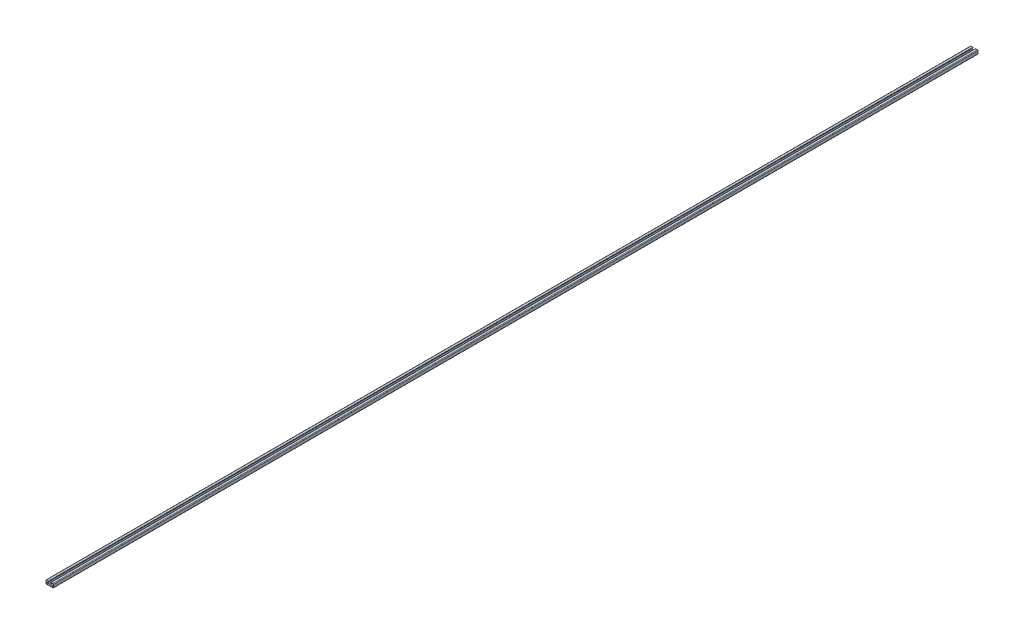
ISO-10303-21;
HEADER;
FILE_DESCRIPTION(('STEP AP214'),'2;1');
FILE_NAME('part.step','',(''),(''),'','','');
FILE_SCHEMA(('AUTOMOTIVE_DESIGN { 1 0 10303 214 1 1 1 1 }'));
ENDSEC;
DATA;
#1=APPLICATION_CONTEXT('core data for automotive mechanical design processes');
#2=APPLICATION_PROTOCOL_DEFINITION('international standard','automotive_design',2000,#1);
#3=PRODUCT_CONTEXT('',#1,'mechanical');
#4=PRODUCT('Part','Part','',(#3));
#5=PRODUCT_RELATED_PRODUCT_CATEGORY('part','',(#4));
#6=PRODUCT_DEFINITION_FORMATION('','',#4);
#7=PRODUCT_DEFINITION_CONTEXT('part definition',#1,'design');
#8=PRODUCT_DEFINITION('design','',#6,#7);
#9=PRODUCT_DEFINITION_SHAPE('','',#8);
#10=(LENGTH_UNIT() NAMED_UNIT(*) SI_UNIT(.MILLI.,.METRE.));
#11=(NAMED_UNIT(*) PLANE_ANGLE_UNIT() SI_UNIT($,.RADIAN.));
#12=(NAMED_UNIT(*) SI_UNIT($,.STERADIAN.) SOLID_ANGLE_UNIT());
#13=UNCERTAINTY_MEASURE_WITH_UNIT(LENGTH_MEASURE(1.E-05),#10,'distance_accuracy_value','');
#14=(GEOMETRIC_REPRESENTATION_CONTEXT(3) GLOBAL_UNCERTAINTY_ASSIGNED_CONTEXT((#13)) GLOBAL_UNIT_ASSIGNED_CONTEXT((#10,
#11,#12)) REPRESENTATION_CONTEXT('',''));
#15=CARTESIAN_POINT('',(0.,0.,0.));
#16=DIRECTION('',(0.,0.,1.));
#17=DIRECTION('',(1.,0.,0.));
#18=AXIS2_PLACEMENT_3D('',#15,#16,#17);
#19=CARTESIAN_POINT('',(0.,-1.87,3048.));
#20=DIRECTION('',(0.,-1.,0.));
#21=DIRECTION('',(1.,0.,0.));
#22=AXIS2_PLACEMENT_3D('',#19,#20,#21);
#23=PLANE('',#22);
#24=DIRECTION('',(-1.,0.,0.));
#25=VECTOR('',#24,1.);
#26=CARTESIAN_POINT('',(0.,-1.87,3048.));
#27=LINE('',#26,#25);
#28=CARTESIAN_POINT('',(1.68956591371127,-1.87,3048.));
#29=VERTEX_POINT('',#28);
#30=CARTESIAN_POINT('',(-1.68956591371128,-1.87,3048.));
#31=VERTEX_POINT('',#30);
#32=EDGE_CURVE('E389',#29,#31,#27,.T.);
#33=ORIENTED_EDGE('',*,*,#32,.F.);
#34=DIRECTION('',(0.,0.,-1.));
#35=VECTOR('',#34,1.);
#36=CARTESIAN_POINT('',(1.68956591371127,-1.87,0.));
#37=LINE('',#36,#35);
#38=CARTESIAN_POINT('',(1.68956591371127,-1.87,0.));
#39=VERTEX_POINT('',#38);
#40=EDGE_CURVE('E379',#29,#39,#37,.T.);
#41=ORIENTED_EDGE('',*,*,#40,.T.);
#42=DIRECTION('',(-1.,0.,0.));
#43=VECTOR('',#42,1.);
#44=CARTESIAN_POINT('',(0.,-1.87,0.));
#45=LINE('',#44,#43);
#46=CARTESIAN_POINT('',(-1.68956591371128,-1.87,0.));
#47=VERTEX_POINT('',#46);
#48=EDGE_CURVE('E388',#39,#47,#45,.T.);
#49=ORIENTED_EDGE('',*,*,#48,.T.);
#50=DIRECTION('',(0.,0.,-1.));
#51=VECTOR('',#50,1.);
#52=CARTESIAN_POINT('',(-1.68956591371128,-1.87,3048.));
#53=LINE('',#52,#51);
#54=EDGE_CURVE('E368',#47,#31,#53,.F.);
#55=ORIENTED_EDGE('',*,*,#54,.T.);
#56=EDGE_LOOP('',(#33,#41,#49,#55));
#57=FACE_BOUND('',#56,.T.);
#58=ADVANCED_FACE('F41',(#57),#23,.F.);
#59=CARTESIAN_POINT('',(-3.05778914340892,-2.14411755860608,3048.));
#60=DIRECTION('',(-0.818770593875491,-0.574120818821941,0.));
#61=DIRECTION('',(0.574120818821941,-0.818770593875491,0.));
#62=AXIS2_PLACEMENT_3D('',#59,#60,#61);
#63=PLANE('',#62);
#64=DIRECTION('',(-0.574120818821941,0.818770593875491,0.));
#65=VECTOR('',#64,1.);
#66=CARTESIAN_POINT('',(-3.05778914340892,-2.14411755860608,3048.));
#67=LINE('',#66,#65);
#68=CARTESIAN_POINT('',(-4.14587769533775,-0.592362456465821,3048.));
#69=VERTEX_POINT('',#68);
#70=CARTESIAN_POINT('',(-6.75724174982656,3.13178066397732,3048.));
#71=VERTEX_POINT('',#70);
#72=EDGE_CURVE('E532',#69,#71,#67,.T.);
#73=ORIENTED_EDGE('',*,*,#72,.F.);
#74=DIRECTION('',(0.,0.,-1.));
#75=VECTOR('',#74,1.);
#76=CARTESIAN_POINT('',(-4.14587769533775,-0.592362456465821,0.));
#77=LINE('',#76,#75);
#78=CARTESIAN_POINT('',(-4.14587769533775,-0.592362456465821,0.));
#79=VERTEX_POINT('',#78);
#80=EDGE_CURVE('E364',#69,#79,#77,.T.);
#81=ORIENTED_EDGE('',*,*,#80,.T.);
#82=DIRECTION('',(-0.574120818821941,0.818770593875491,0.));
#83=VECTOR('',#82,1.);
#84=CARTESIAN_POINT('',(-3.05778914340892,-2.14411755860608,0.));
#85=LINE('',#84,#83);
#86=CARTESIAN_POINT('',(-6.75724174982656,3.13178066397732,0.));
#87=VERTEX_POINT('',#86);
#88=EDGE_CURVE('E395',#79,#87,#85,.T.);
#89=ORIENTED_EDGE('',*,*,#88,.T.);
#90=DIRECTION('',(0.,0.,-1.));
#91=VECTOR('',#90,1.);
#92=CARTESIAN_POINT('',(-6.75724174982656,3.13178066397732,3048.));
#93=LINE('',#92,#91);
#94=EDGE_CURVE('E353',#87,#71,#93,.F.);
#95=ORIENTED_EDGE('',*,*,#94,.T.);
#96=EDGE_LOOP('',(#73,#81,#89,#95));
#97=FACE_BOUND('',#96,.T.);
#98=ADVANCED_FACE('F484',(#97),#63,.F.);
#99=CARTESIAN_POINT('',(0.,3.97,3048.));
#100=DIRECTION('',(0.,-1.,0.));
#101=DIRECTION('',(1.,0.,0.));
#102=AXIS2_PLACEMENT_3D('',#99,#100,#101);
#103=PLANE('',#102);
#104=DIRECTION('',(-1.,0.,0.));
#105=VECTOR('',#104,1.);
#106=CARTESIAN_POINT('',(0.,3.97,3048.));
#107=LINE('',#106,#105);
#108=CARTESIAN_POINT('',(-4.315,3.97,3048.));
#109=VERTEX_POINT('',#108);
#110=CARTESIAN_POINT('',(-6.32124640858786,3.97,3048.));
#111=VERTEX_POINT('',#110);
#112=EDGE_CURVE('E455',#109,#111,#107,.T.);
#113=ORIENTED_EDGE('',*,*,#112,.T.);
#114=DIRECTION('',(0.,0.,-1.));
#115=VECTOR('',#114,1.);
#116=CARTESIAN_POINT('',(-6.32124640858786,3.97,3048.));
#117=LINE('',#116,#115);
#118=CARTESIAN_POINT('',(-6.32124640858786,3.97,0.));
#119=VERTEX_POINT('',#118);
#120=EDGE_CURVE('E349',#111,#119,#117,.T.);
#121=ORIENTED_EDGE('',*,*,#120,.T.);
#122=DIRECTION('',(-1.,0.,0.));
#123=VECTOR('',#122,1.);
#124=CARTESIAN_POINT('',(0.,3.97,0.));
#125=LINE('',#124,#123);
#126=CARTESIAN_POINT('',(-4.315,3.97,0.));
#127=VERTEX_POINT('',#126);
#128=EDGE_CURVE('E226',#127,#119,#125,.T.);
#129=ORIENTED_EDGE('',*,*,#128,.F.);
#130=DIRECTION('',(0.,0.,-1.));
#131=VECTOR('',#130,1.);
#132=CARTESIAN_POINT('',(-4.315,3.97,3048.));
#133=LINE('',#132,#131);
#134=EDGE_CURVE('E251',#127,#109,#133,.F.);
#135=ORIENTED_EDGE('',*,*,#134,.T.);
#136=EDGE_LOOP('',(#113,#121,#129,#135));
#137=FACE_BOUND('',#136,.T.);
#138=ADVANCED_FACE('F489',(#137),#103,.T.);
#139=CARTESIAN_POINT('',(-3.25,0.,3048.));
#140=DIRECTION('',(1.,0.,0.));
#141=DIRECTION('',(0.,1.,0.));
#142=AXIS2_PLACEMENT_3D('',#139,#140,#141);
#143=PLANE('',#142);
#144=DIRECTION('',(0.,-1.,0.));
#145=VECTOR('',#144,1.);
#146=CARTESIAN_POINT('',(-3.25,0.,3048.));
#147=LINE('',#146,#145);
#148=CARTESIAN_POINT('',(-3.25,5.185,3048.));
#149=VERTEX_POINT('',#148);
#150=CARTESIAN_POINT('',(-3.25,5.035,3048.));
#151=VERTEX_POINT('',#150);
#152=EDGE_CURVE('E540',#149,#151,#147,.T.);
#153=ORIENTED_EDGE('',*,*,#152,.T.);
#154=DIRECTION('',(0.,0.,-1.));
#155=VECTOR('',#154,1.);
#156=CARTESIAN_POINT('',(-3.25,5.035,3048.));
#157=LINE('',#156,#155);
#158=CARTESIAN_POINT('',(-3.25,5.035,0.));
#159=VERTEX_POINT('',#158);
#160=EDGE_CURVE('E224',#151,#159,#157,.T.);
#161=ORIENTED_EDGE('',*,*,#160,.T.);
#162=DIRECTION('',(0.,-1.,0.));
#163=VECTOR('',#162,1.);
#164=CARTESIAN_POINT('',(-3.25,0.,0.));
#165=LINE('',#164,#163);
#166=CARTESIAN_POINT('',(-3.25,5.185,0.));
#167=VERTEX_POINT('',#166);
#168=EDGE_CURVE('E206',#167,#159,#165,.T.);
#169=ORIENTED_EDGE('',*,*,#168,.F.);
#170=DIRECTION('',(0.,0.,-1.));
#171=VECTOR('',#170,1.);
#172=CARTESIAN_POINT('',(-3.25,5.185,3048.));
#173=LINE('',#172,#171);
#174=EDGE_CURVE('E221',#167,#149,#173,.F.);
#175=ORIENTED_EDGE('',*,*,#174,.T.);
#176=EDGE_LOOP('',(#153,#161,#169,#175));
#177=FACE_BOUND('',#176,.T.);
#178=ADVANCED_FACE('F220',(#177),#143,.T.);
#179=CARTESIAN_POINT('',(0.,6.25,3048.));
#180=DIRECTION('',(0.,-1.,0.));
#181=DIRECTION('',(1.,0.,0.));
#182=AXIS2_PLACEMENT_3D('',#179,#180,#181);
#183=PLANE('',#182);
#184=DIRECTION('',(-1.,0.,0.));
#185=VECTOR('',#184,1.);
#186=CARTESIAN_POINT('',(0.,6.25,0.));
#187=LINE('',#186,#185);
#188=CARTESIAN_POINT('',(-4.315,6.25,0.));
#189=VERTEX_POINT('',#188);
#190=CARTESIAN_POINT('',(-10.37,6.25,0.));
#191=VERTEX_POINT('',#190);
#192=EDGE_CURVE('E208',#189,#191,#187,.T.);
#193=ORIENTED_EDGE('',*,*,#192,.T.);
#194=DIRECTION('',(0.,0.,-1.));
#195=VECTOR('',#194,1.);
#196=CARTESIAN_POINT('',(-10.37,6.25,3048.));
#197=LINE('',#196,#195);
#198=CARTESIAN_POINT('',(-10.37,6.25,3048.));
#199=VERTEX_POINT('',#198);
#200=EDGE_CURVE('E333',#191,#199,#197,.F.);
#201=ORIENTED_EDGE('',*,*,#200,.T.);
#202=DIRECTION('',(-1.,0.,0.));
#203=VECTOR('',#202,1.);
#204=CARTESIAN_POINT('',(0.,6.25,3048.));
#205=LINE('',#204,#203);
#206=CARTESIAN_POINT('',(-4.315,6.25,3048.));
#207=VERTEX_POINT('',#206);
#208=EDGE_CURVE('E458',#207,#199,#205,.T.);
#209=ORIENTED_EDGE('',*,*,#208,.F.);
#210=DIRECTION('',(0.,0.,-1.));
#211=VECTOR('',#210,1.);
#212=CARTESIAN_POINT('',(-4.315,6.25,0.));
#213=LINE('',#212,#211);
#214=EDGE_CURVE('E266',#207,#189,#213,.T.);
#215=ORIENTED_EDGE('',*,*,#214,.T.);
#216=EDGE_LOOP('',(#193,#201,#209,#215));
#217=FACE_BOUND('',#216,.T.);
#218=ADVANCED_FACE('F495',(#217),#183,.F.);
#219=CARTESIAN_POINT('',(-12.5,0.,3048.));
#220=DIRECTION('',(1.,0.,0.));
#221=DIRECTION('',(0.,1.,0.));
#222=AXIS2_PLACEMENT_3D('',#219,#220,#221);
#223=PLANE('',#222);
#224=DIRECTION('',(0.,-1.,0.));
#225=VECTOR('',#224,1.);
#226=CARTESIAN_POINT('',(-12.5,0.,0.));
#227=LINE('',#226,#225);
#228=CARTESIAN_POINT('',(-12.5,4.12,0.));
#229=VERTEX_POINT('',#228);
#230=CARTESIAN_POINT('',(-12.5,-4.12,0.));
#231=VERTEX_POINT('',#230);
#232=EDGE_CURVE('E412',#229,#231,#227,.T.);
#233=ORIENTED_EDGE('',*,*,#232,.T.);
#234=DIRECTION('',(0.,0.,-1.));
#235=VECTOR('',#234,1.);
#236=CARTESIAN_POINT('',(-12.5,-4.12,3048.));
#237=LINE('',#236,#235);
#238=CARTESIAN_POINT('',(-12.5,-4.12,3048.));
#239=VERTEX_POINT('',#238);
#240=EDGE_CURVE('E330',#231,#239,#237,.F.);
#241=ORIENTED_EDGE('',*,*,#240,.T.);
#242=DIRECTION('',(0.,-1.,0.));
#243=VECTOR('',#242,1.);
#244=CARTESIAN_POINT('',(-12.5,0.,3048.));
#245=LINE('',#244,#243);
#246=CARTESIAN_POINT('',(-12.5,4.12,3048.));
#247=VERTEX_POINT('',#246);
#248=EDGE_CURVE('E545',#247,#239,#245,.T.);
#249=ORIENTED_EDGE('',*,*,#248,.F.);
#250=DIRECTION('',(0.,0.,-1.));
#251=VECTOR('',#250,1.);
#252=CARTESIAN_POINT('',(-12.5,4.12,3048.));
#253=LINE('',#252,#251);
#254=EDGE_CURVE('E326',#247,#229,#253,.T.);
#255=ORIENTED_EDGE('',*,*,#254,.T.);
#256=EDGE_LOOP('',(#233,#241,#249,#255));
#257=FACE_BOUND('',#256,.T.);
#258=ADVANCED_FACE('F496',(#257),#223,.F.);
#259=CARTESIAN_POINT('',(0.,-6.25,3048.));
#260=DIRECTION('',(0.,-1.,0.));
#261=DIRECTION('',(1.,0.,0.));
#262=AXIS2_PLACEMENT_3D('',#259,#260,#261);
#263=PLANE('',#262);
#264=DIRECTION('',(-1.,0.,0.));
#265=VECTOR('',#264,1.);
#266=CARTESIAN_POINT('',(0.,-6.25,0.));
#267=LINE('',#266,#265);
#268=CARTESIAN_POINT('',(10.37,-6.25,0.));
#269=VERTEX_POINT('',#268);
#270=CARTESIAN_POINT('',(-10.37,-6.25,0.));
#271=VERTEX_POINT('',#270);
#272=EDGE_CURVE('E417',#269,#271,#267,.T.);
#273=ORIENTED_EDGE('',*,*,#272,.F.);
#274=DIRECTION('',(0.,0.,-1.));
#275=VECTOR('',#274,1.);
#276=CARTESIAN_POINT('',(10.37,-6.25,3048.));
#277=LINE('',#276,#275);
#278=CARTESIAN_POINT('',(10.37,-6.25,3048.));
#279=VERTEX_POINT('',#278);
#280=EDGE_CURVE('E314',#269,#279,#277,.F.);
#281=ORIENTED_EDGE('',*,*,#280,.T.);
#282=DIRECTION('',(-1.,0.,0.));
#283=VECTOR('',#282,1.);
#284=CARTESIAN_POINT('',(0.,-6.25,3048.));
#285=LINE('',#284,#283);
#286=CARTESIAN_POINT('',(-10.37,-6.25,3048.));
#287=VERTEX_POINT('',#286);
#288=EDGE_CURVE('E548',#279,#287,#285,.T.);
#289=ORIENTED_EDGE('',*,*,#288,.T.);
#290=DIRECTION('',(0.,0.,-1.));
#291=VECTOR('',#290,1.);
#292=CARTESIAN_POINT('',(-10.37,-6.25,0.));
#293=LINE('',#292,#291);
#294=EDGE_CURVE('E310',#287,#271,#293,.T.);
#295=ORIENTED_EDGE('',*,*,#294,.T.);
#296=EDGE_LOOP('',(#273,#281,#289,#295));
#297=FACE_BOUND('',#296,.T.);
#298=ADVANCED_FACE('F499',(#297),#263,.T.);
#299=CARTESIAN_POINT('',(12.5,0.,3048.));
#300=DIRECTION('',(1.,0.,0.));
#301=DIRECTION('',(0.,1.,0.));
#302=AXIS2_PLACEMENT_3D('',#299,#300,#301);
#303=PLANE('',#302);
#304=DIRECTION('',(0.,-1.,0.));
#305=VECTOR('',#304,1.);
#306=CARTESIAN_POINT('',(12.5,0.,3048.));
#307=LINE('',#306,#305);
#308=CARTESIAN_POINT('',(12.5,4.12,3048.));
#309=VERTEX_POINT('',#308);
#310=CARTESIAN_POINT('',(12.5,-4.12,3048.));
#311=VERTEX_POINT('',#310);
#312=EDGE_CURVE('E456',#309,#311,#307,.T.);
#313=ORIENTED_EDGE('',*,*,#312,.T.);
#314=DIRECTION('',(0.,0.,-1.));
#315=VECTOR('',#314,1.);
#316=CARTESIAN_POINT('',(12.5,-4.12,3048.));
#317=LINE('',#316,#315);
#318=CARTESIAN_POINT('',(12.5,-4.12,0.));
#319=VERTEX_POINT('',#318);
#320=EDGE_CURVE('E297',#311,#319,#317,.T.);
#321=ORIENTED_EDGE('',*,*,#320,.T.);
#322=DIRECTION('',(0.,-1.,0.));
#323=VECTOR('',#322,1.);
#324=CARTESIAN_POINT('',(12.5,0.,0.));
#325=LINE('',#324,#323);
#326=CARTESIAN_POINT('',(12.5,4.12,0.));
#327=VERTEX_POINT('',#326);
#328=EDGE_CURVE('E421',#327,#319,#325,.T.);
#329=ORIENTED_EDGE('',*,*,#328,.F.);
#330=DIRECTION('',(0.,0.,-1.));
#331=VECTOR('',#330,1.);
#332=CARTESIAN_POINT('',(12.5,4.12,3048.));
#333=LINE('',#332,#331);
#334=EDGE_CURVE('E291',#327,#309,#333,.F.);
#335=ORIENTED_EDGE('',*,*,#334,.T.);
#336=EDGE_LOOP('',(#313,#321,#329,#335));
#337=FACE_BOUND('',#336,.T.);
#338=ADVANCED_FACE('F503',(#337),#303,.T.);
#339=CARTESIAN_POINT('',(10.37,6.25,3048.));
#340=VERTEX_POINT('',#339);
#341=CARTESIAN_POINT('',(4.315,6.25,3048.));
#342=VERTEX_POINT('',#341);
#343=EDGE_CURVE('E448',#340,#342,#205,.T.);
#344=ORIENTED_EDGE('',*,*,#343,.F.);
#345=DIRECTION('',(0.,0.,-1.));
#346=VECTOR('',#345,1.);
#347=CARTESIAN_POINT('',(10.37,6.25,0.));
#348=LINE('',#347,#346);
#349=CARTESIAN_POINT('',(10.37,6.25,0.));
#350=VERTEX_POINT('',#349);
#351=EDGE_CURVE('E284',#340,#350,#348,.T.);
#352=ORIENTED_EDGE('',*,*,#351,.T.);
#353=CARTESIAN_POINT('',(4.315,6.25,0.));
#354=VERTEX_POINT('',#353);
#355=EDGE_CURVE('E413',#350,#354,#187,.T.);
#356=ORIENTED_EDGE('',*,*,#355,.T.);
#357=DIRECTION('',(0.,0.,-1.));
#358=VECTOR('',#357,1.);
#359=CARTESIAN_POINT('',(4.315,6.25,3048.));
#360=LINE('',#359,#358);
#361=EDGE_CURVE('E280',#354,#342,#360,.F.);
#362=ORIENTED_EDGE('',*,*,#361,.T.);
#363=EDGE_LOOP('',(#344,#352,#356,#362));
#364=FACE_BOUND('',#363,.T.);
#365=ADVANCED_FACE('F434',(#364),#183,.F.);
#366=CARTESIAN_POINT('',(3.25,0.,3048.));
#367=DIRECTION('',(1.,0.,0.));
#368=DIRECTION('',(0.,1.,0.));
#369=AXIS2_PLACEMENT_3D('',#366,#367,#368);
#370=PLANE('',#369);
#371=DIRECTION('',(0.,-1.,0.));
#372=VECTOR('',#371,1.);
#373=CARTESIAN_POINT('',(3.25,0.,0.));
#374=LINE('',#373,#372);
#375=CARTESIAN_POINT('',(3.25,5.185,0.));
#376=VERTEX_POINT('',#375);
#377=CARTESIAN_POINT('',(3.25,5.035,0.));
#378=VERTEX_POINT('',#377);
#379=EDGE_CURVE('E423',#376,#378,#374,.T.);
#380=ORIENTED_EDGE('',*,*,#379,.T.);
#381=DIRECTION('',(0.,0.,-1.));
#382=VECTOR('',#381,1.);
#383=CARTESIAN_POINT('',(3.25,5.035,3048.));
#384=LINE('',#383,#382);
#385=CARTESIAN_POINT('',(3.25,5.035,3048.));
#386=VERTEX_POINT('',#385);
#387=EDGE_CURVE('E277',#378,#386,#384,.F.);
#388=ORIENTED_EDGE('',*,*,#387,.T.);
#389=DIRECTION('',(0.,-1.,0.));
#390=VECTOR('',#389,1.);
#391=CARTESIAN_POINT('',(3.25,0.,3048.));
#392=LINE('',#391,#390);
#393=CARTESIAN_POINT('',(3.25,5.185,3048.));
#394=VERTEX_POINT('',#393);
#395=EDGE_CURVE('E446',#394,#386,#392,.T.);
#396=ORIENTED_EDGE('',*,*,#395,.F.);
#397=DIRECTION('',(0.,0.,-1.));
#398=VECTOR('',#397,1.);
#399=CARTESIAN_POINT('',(3.25,5.185,3048.));
#400=LINE('',#399,#398);
#401=EDGE_CURVE('E273',#394,#376,#400,.T.);
#402=ORIENTED_EDGE('',*,*,#401,.T.);
#403=EDGE_LOOP('',(#380,#388,#396,#402));
#404=FACE_BOUND('',#403,.T.);
#405=ADVANCED_FACE('F449',(#404),#370,.F.);
#406=CARTESIAN_POINT('',(6.32124640858786,3.97,0.));
#407=VERTEX_POINT('',#406);
#408=CARTESIAN_POINT('',(4.315,3.97,0.));
#409=VERTEX_POINT('',#408);
#410=EDGE_CURVE('E408',#407,#409,#125,.T.);
#411=ORIENTED_EDGE('',*,*,#410,.F.);
#412=DIRECTION('',(0.,0.,-1.));
#413=VECTOR('',#412,1.);
#414=CARTESIAN_POINT('',(6.32124640858786,3.97,3048.));
#415=LINE('',#414,#413);
#416=CARTESIAN_POINT('',(6.32124640858786,3.97,3048.));
#417=VERTEX_POINT('',#416);
#418=EDGE_CURVE('E340',#407,#417,#415,.F.);
#419=ORIENTED_EDGE('',*,*,#418,.T.);
#420=CARTESIAN_POINT('',(4.315,3.97,3048.));
#421=VERTEX_POINT('',#420);
#422=EDGE_CURVE('E238',#417,#421,#107,.T.);
#423=ORIENTED_EDGE('',*,*,#422,.T.);
#424=DIRECTION('',(0.,0.,-1.));
#425=VECTOR('',#424,1.);
#426=CARTESIAN_POINT('',(4.315,3.97,0.));
#427=LINE('',#426,#425);
#428=EDGE_CURVE('E269',#421,#409,#427,.T.);
#429=ORIENTED_EDGE('',*,*,#428,.T.);
#430=EDGE_LOOP('',(#411,#419,#423,#429));
#431=FACE_BOUND('',#430,.T.);
#432=ADVANCED_FACE('F478',(#431),#103,.T.);
#433=CARTESIAN_POINT('',(-8.5,-2.25,3048.));
#434=DIRECTION('',(0.,0.,-1.));
#435=DIRECTION('',(-1.,0.,0.));
#436=AXIS2_PLACEMENT_3D('',#433,#434,#435);
#437=CYLINDRICAL_SURFACE('',#436,2.);
#438=CARTESIAN_POINT('',(-8.5,-2.25,3048.));
#439=DIRECTION('',(0.,0.,1.));
#440=DIRECTION('',(1.,0.,0.));
#441=AXIS2_PLACEMENT_3D('',#438,#439,#440);
#442=CIRCLE('',#441,2.);
#443=CARTESIAN_POINT('',(-6.5,-2.25,3048.));
#444=VERTEX_POINT('',#443);
#445=EDGE_CURVE('E527',#444,#444,#442,.T.);
#446=ORIENTED_EDGE('',*,*,#445,.T.);
#447=EDGE_LOOP('',(#446));
#448=FACE_BOUND('',#447,.T.);
#449=CARTESIAN_POINT('',(-8.5,-2.25,0.));
#450=DIRECTION('',(0.,0.,1.));
#451=DIRECTION('',(1.,0.,0.));
#452=AXIS2_PLACEMENT_3D('',#449,#450,#451);
#453=CIRCLE('',#452,2.);
#454=CARTESIAN_POINT('',(-6.5,-2.25,0.));
#455=VERTEX_POINT('',#454);
#456=EDGE_CURVE('E396',#455,#455,#453,.T.);
#457=ORIENTED_EDGE('',*,*,#456,.F.);
#458=EDGE_LOOP('',(#457));
#459=FACE_BOUND('',#458,.T.);
#460=ADVANCED_FACE('F470',(#448,#459),#437,.F.);
#461=CARTESIAN_POINT('',(8.5,-2.25,3048.));
#462=DIRECTION('',(0.,0.,-1.));
#463=DIRECTION('',(-1.,0.,0.));
#464=AXIS2_PLACEMENT_3D('',#461,#462,#463);
#465=CYLINDRICAL_SURFACE('',#464,2.);
#466=CARTESIAN_POINT('',(8.5,-2.25,3048.));
#467=DIRECTION('',(0.,0.,1.));
#468=DIRECTION('',(1.,0.,0.));
#469=AXIS2_PLACEMENT_3D('',#466,#467,#468);
#470=CIRCLE('',#469,2.);
#471=CARTESIAN_POINT('',(10.5,-2.25,3048.));
#472=VERTEX_POINT('',#471);
#473=EDGE_CURVE('E524',#472,#472,#470,.T.);
#474=ORIENTED_EDGE('',*,*,#473,.T.);
#475=EDGE_LOOP('',(#474));
#476=FACE_BOUND('',#475,.T.);
#477=CARTESIAN_POINT('',(8.5,-2.25,0.));
#478=DIRECTION('',(0.,0.,1.));
#479=DIRECTION('',(1.,0.,0.));
#480=AXIS2_PLACEMENT_3D('',#477,#478,#479);
#481=CIRCLE('',#480,2.);
#482=CARTESIAN_POINT('',(10.5,-2.25,0.));
#483=VERTEX_POINT('',#482);
#484=EDGE_CURVE('E402',#483,#483,#481,.T.);
#485=ORIENTED_EDGE('',*,*,#484,.F.);
#486=EDGE_LOOP('',(#485));
#487=FACE_BOUND('',#486,.T.);
#488=ADVANCED_FACE('F467',(#476,#487),#465,.F.);
#489=CARTESIAN_POINT('',(3.05778914340892,-2.14411755860608,3048.));
#490=DIRECTION('',(0.818770593875491,-0.574120818821941,0.));
#491=DIRECTION('',(0.574120818821941,0.818770593875491,0.));
#492=AXIS2_PLACEMENT_3D('',#489,#490,#491);
#493=PLANE('',#492);
#494=DIRECTION('',(-0.574120818821941,-0.818770593875491,0.));
#495=VECTOR('',#494,1.);
#496=CARTESIAN_POINT('',(3.05778914340892,-2.14411755860608,0.));
#497=LINE('',#496,#495);
#498=CARTESIAN_POINT('',(6.75724174982656,3.13178066397732,0.));
#499=VERTEX_POINT('',#498);
#500=CARTESIAN_POINT('',(4.14587769533775,-0.592362456465818,0.));
#501=VERTEX_POINT('',#500);
#502=EDGE_CURVE('E241',#499,#501,#497,.T.);
#503=ORIENTED_EDGE('',*,*,#502,.T.);
#504=DIRECTION('',(0.,0.,-1.));
#505=VECTOR('',#504,1.);
#506=CARTESIAN_POINT('',(4.14587769533775,-0.592362456465819,3048.));
#507=LINE('',#506,#505);
#508=CARTESIAN_POINT('',(4.14587769533775,-0.592362456465818,3048.));
#509=VERTEX_POINT('',#508);
#510=EDGE_CURVE('E63',#501,#509,#507,.F.);
#511=ORIENTED_EDGE('',*,*,#510,.T.);
#512=DIRECTION('',(-0.574120818821941,-0.818770593875491,0.));
#513=VECTOR('',#512,1.);
#514=CARTESIAN_POINT('',(3.05778914340892,-2.14411755860608,3048.));
#515=LINE('',#514,#513);
#516=CARTESIAN_POINT('',(6.75724174982656,3.13178066397732,3048.));
#517=VERTEX_POINT('',#516);
#518=EDGE_CURVE('E232',#517,#509,#515,.T.);
#519=ORIENTED_EDGE('',*,*,#518,.F.);
#520=DIRECTION('',(0.,0.,-1.));
#521=VECTOR('',#520,1.);
#522=CARTESIAN_POINT('',(6.75724174982656,3.13178066397732,3048.));
#523=LINE('',#522,#521);
#524=EDGE_CURVE('E336',#517,#499,#523,.T.);
#525=ORIENTED_EDGE('',*,*,#524,.T.);
#526=EDGE_LOOP('',(#503,#511,#519,#525));
#527=FACE_BOUND('',#526,.T.);
#528=ADVANCED_FACE('F469',(#527),#493,.F.);
#529=CARTESIAN_POINT('',(0.,0.,3048.));
#530=DIRECTION('',(0.,0.,1.));
#531=DIRECTION('',(1.,0.,0.));
#532=AXIS2_PLACEMENT_3D('',#529,#530,#531);
#533=PLANE('',#532);
#534=ORIENTED_EDGE('',*,*,#473,.F.);
#535=EDGE_LOOP('',(#534));
#536=FACE_BOUND('',#535,.T.);
#537=ORIENTED_EDGE('',*,*,#445,.F.);
#538=EDGE_LOOP('',(#537));
#539=FACE_BOUND('',#538,.T.);
#540=ORIENTED_EDGE('',*,*,#288,.F.);
#541=CARTESIAN_POINT('',(10.37,-4.12,3048.));
#542=DIRECTION('',(0.,0.,1.));
#543=DIRECTION('',(1.,0.,0.));
#544=AXIS2_PLACEMENT_3D('',#541,#542,#543);
#545=CIRCLE('',#544,2.13);
#546=EDGE_CURVE('E323',#279,#311,#545,.T.);
#547=ORIENTED_EDGE('',*,*,#546,.T.);
#548=ORIENTED_EDGE('',*,*,#312,.F.);
#549=CARTESIAN_POINT('',(10.37,4.12,3048.));
#550=DIRECTION('',(0.,0.,1.));
#551=DIRECTION('',(1.,0.,0.));
#552=AXIS2_PLACEMENT_3D('',#549,#550,#551);
#553=CIRCLE('',#552,2.13);
#554=EDGE_CURVE('E294',#309,#340,#553,.T.);
#555=ORIENTED_EDGE('',*,*,#554,.T.);
#556=ORIENTED_EDGE('',*,*,#343,.T.);
#557=CARTESIAN_POINT('',(4.315,5.185,3048.));
#558=DIRECTION('',(0.,0.,1.));
#559=DIRECTION('',(1.,0.,0.));
#560=AXIS2_PLACEMENT_3D('',#557,#558,#559);
#561=CIRCLE('',#560,1.065);
#562=EDGE_CURVE('E254',#342,#394,#561,.T.);
#563=ORIENTED_EDGE('',*,*,#562,.T.);
#564=ORIENTED_EDGE('',*,*,#395,.T.);
#565=CARTESIAN_POINT('',(4.315,5.035,3048.));
#566=DIRECTION('',(0.,0.,1.));
#567=DIRECTION('',(1.,0.,0.));
#568=AXIS2_PLACEMENT_3D('',#565,#566,#567);
#569=CIRCLE('',#568,1.065);
#570=EDGE_CURVE('E257',#386,#421,#569,.T.);
#571=ORIENTED_EDGE('',*,*,#570,.T.);
#572=ORIENTED_EDGE('',*,*,#422,.F.);
#573=CARTESIAN_POINT('',(6.32124640858786,3.4375,3048.));
#574=DIRECTION('',(0.,0.,1.));
#575=DIRECTION('',(1.,0.,0.));
#576=AXIS2_PLACEMENT_3D('',#573,#574,#575);
#577=CIRCLE('',#576,0.5325);
#578=EDGE_CURVE('E346',#417,#517,#577,.F.);
#579=ORIENTED_EDGE('',*,*,#578,.T.);
#580=ORIENTED_EDGE('',*,*,#518,.T.);
#581=CARTESIAN_POINT('',(1.68956591371127,1.13,3048.));
#582=DIRECTION('',(0.,0.,1.));
#583=DIRECTION('',(1.,0.,0.));
#584=AXIS2_PLACEMENT_3D('',#581,#582,#583);
#585=CIRCLE('',#584,3.);
#586=EDGE_CURVE('E11',#509,#29,#585,.F.);
#587=ORIENTED_EDGE('',*,*,#586,.T.);
#588=ORIENTED_EDGE('',*,*,#32,.T.);
#589=CARTESIAN_POINT('',(-1.68956591371128,1.13,3048.));
#590=DIRECTION('',(0.,0.,1.));
#591=DIRECTION('',(1.,0.,0.));
#592=AXIS2_PLACEMENT_3D('',#589,#590,#591);
#593=CIRCLE('',#592,3.);
#594=EDGE_CURVE('E376',#31,#69,#593,.F.);
#595=ORIENTED_EDGE('',*,*,#594,.T.);
#596=ORIENTED_EDGE('',*,*,#72,.T.);
#597=CARTESIAN_POINT('',(-6.32124640858786,3.4375,3048.));
#598=DIRECTION('',(0.,0.,1.));
#599=DIRECTION('',(1.,0.,0.));
#600=AXIS2_PLACEMENT_3D('',#597,#598,#599);
#601=CIRCLE('',#600,0.5325);
#602=EDGE_CURVE('E361',#71,#111,#601,.F.);
#603=ORIENTED_EDGE('',*,*,#602,.T.);
#604=ORIENTED_EDGE('',*,*,#112,.F.);
#605=CARTESIAN_POINT('',(-4.315,5.035,3048.));
#606=DIRECTION('',(0.,0.,1.));
#607=DIRECTION('',(1.,0.,0.));
#608=AXIS2_PLACEMENT_3D('',#605,#606,#607);
#609=CIRCLE('',#608,1.065);
#610=EDGE_CURVE('E263',#109,#151,#609,.T.);
#611=ORIENTED_EDGE('',*,*,#610,.T.);
#612=ORIENTED_EDGE('',*,*,#152,.F.);
#613=CARTESIAN_POINT('',(-4.315,5.185,3048.));
#614=DIRECTION('',(0.,0.,1.));
#615=DIRECTION('',(1.,0.,0.));
#616=AXIS2_PLACEMENT_3D('',#613,#614,#615);
#617=CIRCLE('',#616,1.065);
#618=EDGE_CURVE('E230',#149,#207,#617,.T.);
#619=ORIENTED_EDGE('',*,*,#618,.T.);
#620=ORIENTED_EDGE('',*,*,#208,.T.);
#621=CARTESIAN_POINT('',(-10.37,4.12,3048.));
#622=DIRECTION('',(0.,0.,1.));
#623=DIRECTION('',(1.,0.,0.));
#624=AXIS2_PLACEMENT_3D('',#621,#622,#623);
#625=CIRCLE('',#624,2.13);
#626=EDGE_CURVE('E317',#199,#247,#625,.T.);
#627=ORIENTED_EDGE('',*,*,#626,.T.);
#628=ORIENTED_EDGE('',*,*,#248,.T.);
#629=CARTESIAN_POINT('',(-10.37,-4.12,3048.));
#630=DIRECTION('',(0.,0.,1.));
#631=DIRECTION('',(1.,0.,0.));
#632=AXIS2_PLACEMENT_3D('',#629,#630,#631);
#633=CIRCLE('',#632,2.13);
#634=EDGE_CURVE('E320',#239,#287,#633,.T.);
#635=ORIENTED_EDGE('',*,*,#634,.T.);
#636=EDGE_LOOP('',(#540,#547,#548,#555,#556,#563,#564,#571,#572,#579,#580,#587,#588,#595,#596,
#603,#604,#611,#612,#619,#620,#627,#628,#635));
#637=FACE_BOUND('',#636,.T.);
#638=ADVANCED_FACE('F445',(#536,#539,#637),#533,.T.);
#639=CARTESIAN_POINT('',(0.,0.,0.));
#640=DIRECTION('',(0.,0.,1.));
#641=DIRECTION('',(1.,0.,0.));
#642=AXIS2_PLACEMENT_3D('',#639,#640,#641);
#643=PLANE('',#642);
#644=ORIENTED_EDGE('',*,*,#484,.T.);
#645=EDGE_LOOP('',(#644));
#646=FACE_BOUND('',#645,.T.);
#647=ORIENTED_EDGE('',*,*,#456,.T.);
#648=EDGE_LOOP('',(#647));
#649=FACE_BOUND('',#648,.T.);
#650=ORIENTED_EDGE('',*,*,#328,.T.);
#651=CARTESIAN_POINT('',(10.37,-4.12,0.));
#652=DIRECTION('',(0.,0.,1.));
#653=DIRECTION('',(1.,0.,0.));
#654=AXIS2_PLACEMENT_3D('',#651,#652,#653);
#655=CIRCLE('',#654,2.13);
#656=EDGE_CURVE('E307',#319,#269,#655,.F.);
#657=ORIENTED_EDGE('',*,*,#656,.T.);
#658=ORIENTED_EDGE('',*,*,#272,.T.);
#659=CARTESIAN_POINT('',(-10.37,-4.12,0.));
#660=DIRECTION('',(0.,0.,1.));
#661=DIRECTION('',(1.,0.,0.));
#662=AXIS2_PLACEMENT_3D('',#659,#660,#661);
#663=CIRCLE('',#662,2.13);
#664=EDGE_CURVE('E304',#271,#231,#663,.F.);
#665=ORIENTED_EDGE('',*,*,#664,.T.);
#666=ORIENTED_EDGE('',*,*,#232,.F.);
#667=CARTESIAN_POINT('',(-10.37,4.12,0.));
#668=DIRECTION('',(0.,0.,1.));
#669=DIRECTION('',(1.,0.,0.));
#670=AXIS2_PLACEMENT_3D('',#667,#668,#669);
#671=CIRCLE('',#670,2.13);
#672=EDGE_CURVE('E301',#229,#191,#671,.F.);
#673=ORIENTED_EDGE('',*,*,#672,.T.);
#674=ORIENTED_EDGE('',*,*,#192,.F.);
#675=CARTESIAN_POINT('',(-4.315,5.185,0.));
#676=DIRECTION('',(0.,0.,1.));
#677=DIRECTION('',(1.,0.,0.));
#678=AXIS2_PLACEMENT_3D('',#675,#676,#677);
#679=CIRCLE('',#678,1.065);
#680=EDGE_CURVE('E202',#189,#167,#679,.F.);
#681=ORIENTED_EDGE('',*,*,#680,.T.);
#682=ORIENTED_EDGE('',*,*,#168,.T.);
#683=CARTESIAN_POINT('',(-4.315,5.035,0.));
#684=DIRECTION('',(0.,0.,1.));
#685=DIRECTION('',(1.,0.,0.));
#686=AXIS2_PLACEMENT_3D('',#683,#684,#685);
#687=CIRCLE('',#686,1.065);
#688=EDGE_CURVE('E214',#159,#127,#687,.F.);
#689=ORIENTED_EDGE('',*,*,#688,.T.);
#690=ORIENTED_EDGE('',*,*,#128,.T.);
#691=CARTESIAN_POINT('',(-6.32124640858786,3.4375,0.));
#692=DIRECTION('',(0.,0.,1.));
#693=DIRECTION('',(1.,0.,0.));
#694=AXIS2_PLACEMENT_3D('',#691,#692,#693);
#695=CIRCLE('',#694,0.5325);
#696=EDGE_CURVE('E357',#119,#87,#695,.T.);
#697=ORIENTED_EDGE('',*,*,#696,.T.);
#698=ORIENTED_EDGE('',*,*,#88,.F.);
#699=CARTESIAN_POINT('',(-1.68956591371128,1.13,0.));
#700=DIRECTION('',(0.,0.,1.));
#701=DIRECTION('',(1.,0.,0.));
#702=AXIS2_PLACEMENT_3D('',#699,#700,#701);
#703=CIRCLE('',#702,3.);
#704=EDGE_CURVE('E372',#79,#47,#703,.T.);
#705=ORIENTED_EDGE('',*,*,#704,.T.);
#706=ORIENTED_EDGE('',*,*,#48,.F.);
#707=CARTESIAN_POINT('',(1.68956591371127,1.13,0.));
#708=DIRECTION('',(0.,0.,1.));
#709=DIRECTION('',(1.,0.,0.));
#710=AXIS2_PLACEMENT_3D('',#707,#708,#709);
#711=CIRCLE('',#710,3.);
#712=EDGE_CURVE('E50',#39,#501,#711,.T.);
#713=ORIENTED_EDGE('',*,*,#712,.T.);
#714=ORIENTED_EDGE('',*,*,#502,.F.);
#715=CARTESIAN_POINT('',(6.32124640858786,3.4375,0.));
#716=DIRECTION('',(0.,0.,1.));
#717=DIRECTION('',(1.,0.,0.));
#718=AXIS2_PLACEMENT_3D('',#715,#716,#717);
#719=CIRCLE('',#718,0.5325);
#720=EDGE_CURVE('E343',#499,#407,#719,.T.);
#721=ORIENTED_EDGE('',*,*,#720,.T.);
#722=ORIENTED_EDGE('',*,*,#410,.T.);
#723=CARTESIAN_POINT('',(4.315,5.035,0.));
#724=DIRECTION('',(0.,0.,1.));
#725=DIRECTION('',(1.,0.,0.));
#726=AXIS2_PLACEMENT_3D('',#723,#724,#725);
#727=CIRCLE('',#726,1.065);
#728=EDGE_CURVE('E215',#409,#378,#727,.F.);
#729=ORIENTED_EDGE('',*,*,#728,.T.);
#730=ORIENTED_EDGE('',*,*,#379,.F.);
#731=CARTESIAN_POINT('',(4.315,5.185,0.));
#732=DIRECTION('',(0.,0.,1.));
#733=DIRECTION('',(1.,0.,0.));
#734=AXIS2_PLACEMENT_3D('',#731,#732,#733);
#735=CIRCLE('',#734,1.065);
#736=EDGE_CURVE('E236',#376,#354,#735,.F.);
#737=ORIENTED_EDGE('',*,*,#736,.T.);
#738=ORIENTED_EDGE('',*,*,#355,.F.);
#739=CARTESIAN_POINT('',(10.37,4.12,0.));
#740=DIRECTION('',(0.,0.,1.));
#741=DIRECTION('',(1.,0.,0.));
#742=AXIS2_PLACEMENT_3D('',#739,#740,#741);
#743=CIRCLE('',#742,2.13);
#744=EDGE_CURVE('E288',#350,#327,#743,.F.);
#745=ORIENTED_EDGE('',*,*,#744,.T.);
#746=EDGE_LOOP('',(#650,#657,#658,#665,#666,#673,#674,#681,#682,#689,#690,#697,#698,#705,#706,
#713,#714,#721,#722,#729,#730,#737,#738,#745));
#747=FACE_BOUND('',#746,.T.);
#748=ADVANCED_FACE('F205',(#646,#649,#747),#643,.F.);
#749=CARTESIAN_POINT('',(-4.315,5.035,3048.));
#750=DIRECTION('',(0.,0.,-1.));
#751=DIRECTION('',(-1.,0.,0.));
#752=AXIS2_PLACEMENT_3D('',#749,#750,#751);
#753=CYLINDRICAL_SURFACE('',#752,1.065);
#754=ORIENTED_EDGE('',*,*,#610,.F.);
#755=ORIENTED_EDGE('',*,*,#134,.F.);
#756=ORIENTED_EDGE('',*,*,#688,.F.);
#757=ORIENTED_EDGE('',*,*,#160,.F.);
#758=EDGE_LOOP('',(#754,#755,#756,#757));
#759=FACE_BOUND('',#758,.T.);
#760=ADVANCED_FACE('F517',(#759),#753,.T.);
#761=CARTESIAN_POINT('',(-4.315,5.185,3048.));
#762=DIRECTION('',(0.,0.,1.));
#763=DIRECTION('',(1.,0.,0.));
#764=AXIS2_PLACEMENT_3D('',#761,#762,#763);
#765=CYLINDRICAL_SURFACE('',#764,1.065);
#766=ORIENTED_EDGE('',*,*,#618,.F.);
#767=ORIENTED_EDGE('',*,*,#174,.F.);
#768=ORIENTED_EDGE('',*,*,#680,.F.);
#769=ORIENTED_EDGE('',*,*,#214,.F.);
#770=EDGE_LOOP('',(#766,#767,#768,#769));
#771=FACE_BOUND('',#770,.T.);
#772=ADVANCED_FACE('F229',(#771),#765,.T.);
#773=CARTESIAN_POINT('',(4.315,5.035,3048.));
#774=DIRECTION('',(0.,0.,1.));
#775=DIRECTION('',(1.,0.,0.));
#776=AXIS2_PLACEMENT_3D('',#773,#774,#775);
#777=CYLINDRICAL_SURFACE('',#776,1.065);
#778=ORIENTED_EDGE('',*,*,#570,.F.);
#779=ORIENTED_EDGE('',*,*,#387,.F.);
#780=ORIENTED_EDGE('',*,*,#728,.F.);
#781=ORIENTED_EDGE('',*,*,#428,.F.);
#782=EDGE_LOOP('',(#778,#779,#780,#781));
#783=FACE_BOUND('',#782,.T.);
#784=ADVANCED_FACE('F618',(#783),#777,.T.);
#785=CARTESIAN_POINT('',(4.315,5.185,3048.));
#786=DIRECTION('',(0.,0.,-1.));
#787=DIRECTION('',(-1.,0.,0.));
#788=AXIS2_PLACEMENT_3D('',#785,#786,#787);
#789=CYLINDRICAL_SURFACE('',#788,1.065);
#790=ORIENTED_EDGE('',*,*,#562,.F.);
#791=ORIENTED_EDGE('',*,*,#361,.F.);
#792=ORIENTED_EDGE('',*,*,#736,.F.);
#793=ORIENTED_EDGE('',*,*,#401,.F.);
#794=EDGE_LOOP('',(#790,#791,#792,#793));
#795=FACE_BOUND('',#794,.T.);
#796=ADVANCED_FACE('F440',(#795),#789,.T.);
#797=CARTESIAN_POINT('',(10.37,4.12,3048.));
#798=DIRECTION('',(0.,0.,1.));
#799=DIRECTION('',(1.,0.,0.));
#800=AXIS2_PLACEMENT_3D('',#797,#798,#799);
#801=CYLINDRICAL_SURFACE('',#800,2.13);
#802=ORIENTED_EDGE('',*,*,#554,.F.);
#803=ORIENTED_EDGE('',*,*,#334,.F.);
#804=ORIENTED_EDGE('',*,*,#744,.F.);
#805=ORIENTED_EDGE('',*,*,#351,.F.);
#806=EDGE_LOOP('',(#802,#803,#804,#805));
#807=FACE_BOUND('',#806,.T.);
#808=ADVANCED_FACE('F612',(#807),#801,.T.);
#809=CARTESIAN_POINT('',(10.37,-4.12,3048.));
#810=DIRECTION('',(0.,0.,-1.));
#811=DIRECTION('',(-1.,0.,0.));
#812=AXIS2_PLACEMENT_3D('',#809,#810,#811);
#813=CYLINDRICAL_SURFACE('',#812,2.13);
#814=ORIENTED_EDGE('',*,*,#546,.F.);
#815=ORIENTED_EDGE('',*,*,#280,.F.);
#816=ORIENTED_EDGE('',*,*,#656,.F.);
#817=ORIENTED_EDGE('',*,*,#320,.F.);
#818=EDGE_LOOP('',(#814,#815,#816,#817));
#819=FACE_BOUND('',#818,.T.);
#820=ADVANCED_FACE('F561',(#819),#813,.T.);
#821=CARTESIAN_POINT('',(-10.37,-4.12,3048.));
#822=DIRECTION('',(0.,0.,1.));
#823=DIRECTION('',(1.,0.,0.));
#824=AXIS2_PLACEMENT_3D('',#821,#822,#823);
#825=CYLINDRICAL_SURFACE('',#824,2.13);
#826=ORIENTED_EDGE('',*,*,#634,.F.);
#827=ORIENTED_EDGE('',*,*,#240,.F.);
#828=ORIENTED_EDGE('',*,*,#664,.F.);
#829=ORIENTED_EDGE('',*,*,#294,.F.);
#830=EDGE_LOOP('',(#826,#827,#828,#829));
#831=FACE_BOUND('',#830,.T.);
#832=ADVANCED_FACE('F566',(#831),#825,.T.);
#833=CARTESIAN_POINT('',(-10.37,4.12,3048.));
#834=DIRECTION('',(0.,0.,-1.));
#835=DIRECTION('',(-1.,0.,0.));
#836=AXIS2_PLACEMENT_3D('',#833,#834,#835);
#837=CYLINDRICAL_SURFACE('',#836,2.13);
#838=ORIENTED_EDGE('',*,*,#626,.F.);
#839=ORIENTED_EDGE('',*,*,#200,.F.);
#840=ORIENTED_EDGE('',*,*,#672,.F.);
#841=ORIENTED_EDGE('',*,*,#254,.F.);
#842=EDGE_LOOP('',(#838,#839,#840,#841));
#843=FACE_BOUND('',#842,.T.);
#844=ADVANCED_FACE('F573',(#843),#837,.T.);
#845=CARTESIAN_POINT('',(6.32124640858786,3.4375,3048.));
#846=DIRECTION('',(0.,0.,-1.));
#847=DIRECTION('',(-1.,0.,0.));
#848=AXIS2_PLACEMENT_3D('',#845,#846,#847);
#849=CYLINDRICAL_SURFACE('',#848,0.5325);
#850=ORIENTED_EDGE('',*,*,#578,.F.);
#851=ORIENTED_EDGE('',*,*,#418,.F.);
#852=ORIENTED_EDGE('',*,*,#720,.F.);
#853=ORIENTED_EDGE('',*,*,#524,.F.);
#854=EDGE_LOOP('',(#850,#851,#852,#853));
#855=FACE_BOUND('',#854,.T.);
#856=ADVANCED_FACE('F600',(#855),#849,.F.);
#857=CARTESIAN_POINT('',(-6.32124640858786,3.4375,3048.));
#858=DIRECTION('',(0.,0.,-1.));
#859=DIRECTION('',(-1.,0.,0.));
#860=AXIS2_PLACEMENT_3D('',#857,#858,#859);
#861=CYLINDRICAL_SURFACE('',#860,0.5325);
#862=ORIENTED_EDGE('',*,*,#602,.F.);
#863=ORIENTED_EDGE('',*,*,#94,.F.);
#864=ORIENTED_EDGE('',*,*,#696,.F.);
#865=ORIENTED_EDGE('',*,*,#120,.F.);
#866=EDGE_LOOP('',(#862,#863,#864,#865));
#867=FACE_BOUND('',#866,.T.);
#868=ADVANCED_FACE('F586',(#867),#861,.F.);
#869=CARTESIAN_POINT('',(-1.68956591371128,1.13,3048.));
#870=DIRECTION('',(0.,0.,1.));
#871=DIRECTION('',(1.,0.,0.));
#872=AXIS2_PLACEMENT_3D('',#869,#870,#871);
#873=CYLINDRICAL_SURFACE('',#872,3.);
#874=ORIENTED_EDGE('',*,*,#594,.F.);
#875=ORIENTED_EDGE('',*,*,#54,.F.);
#876=ORIENTED_EDGE('',*,*,#704,.F.);
#877=ORIENTED_EDGE('',*,*,#80,.F.);
#878=EDGE_LOOP('',(#874,#875,#876,#877));
#879=FACE_BOUND('',#878,.T.);
#880=ADVANCED_FACE('F592',(#879),#873,.F.);
#881=CARTESIAN_POINT('',(1.68956591371127,1.13,3048.));
#882=DIRECTION('',(0.,0.,1.));
#883=DIRECTION('',(1.,0.,0.));
#884=AXIS2_PLACEMENT_3D('',#881,#882,#883);
#885=CYLINDRICAL_SURFACE('',#884,3.);
#886=ORIENTED_EDGE('',*,*,#586,.F.);
#887=ORIENTED_EDGE('',*,*,#510,.F.);
#888=ORIENTED_EDGE('',*,*,#712,.F.);
#889=ORIENTED_EDGE('',*,*,#40,.F.);
#890=EDGE_LOOP('',(#886,#887,#888,#889));
#891=FACE_BOUND('',#890,.T.);
#892=ADVANCED_FACE('F43',(#891),#885,.F.);
#893=CLOSED_SHELL('',(#58,#98,#138,#178,#218,#258,#298,#338,#365,#405,#432,#460,#488,#528,#638,
#748,#760,#772,#784,#796,#808,#820,#832,#844,#856,#868,#880,#892));
#894=MANIFOLD_SOLID_BREP('B2',#893);
#895=ADVANCED_BREP_SHAPE_REPRESENTATION('',(#18,#894),#14);
#896=SHAPE_DEFINITION_REPRESENTATION(#9,#895);
ENDSEC;
END-ISO-10303-21;
